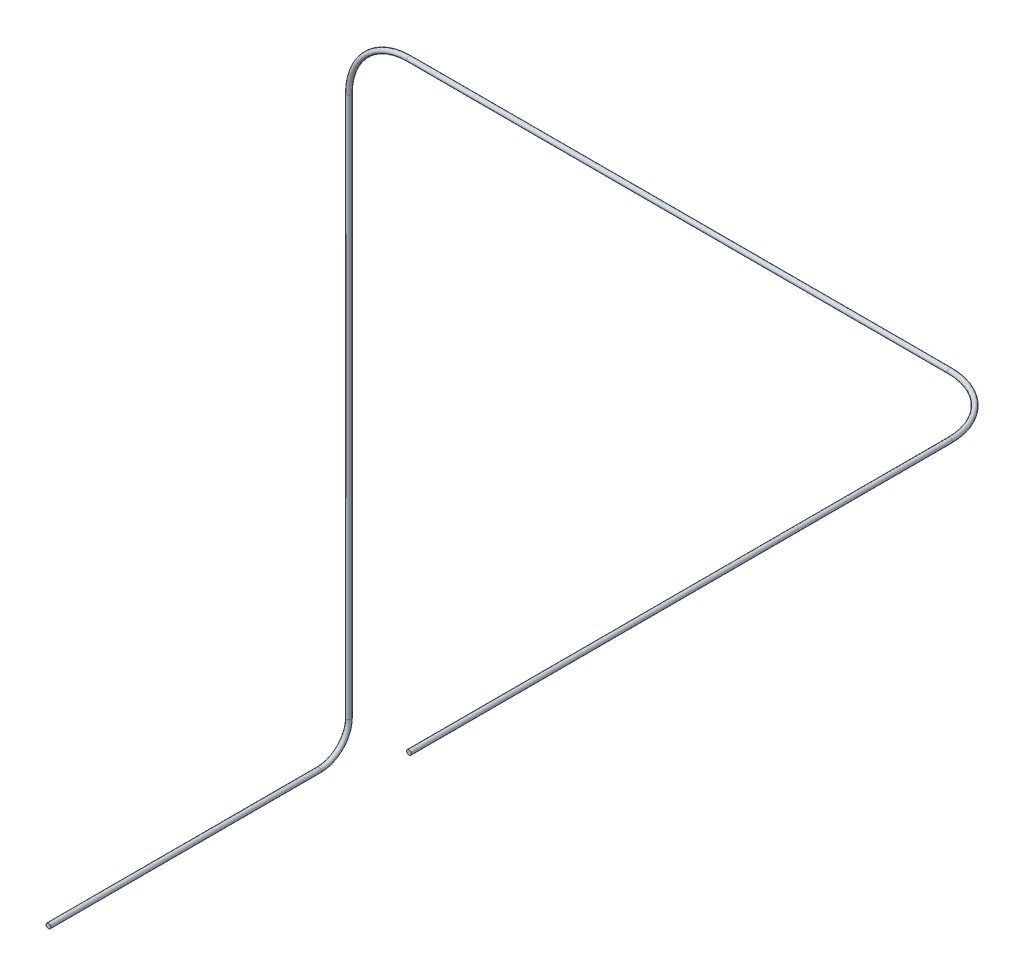
ISO-10303-21;
HEADER;
FILE_DESCRIPTION(('STEP AP214'),'2;1');
FILE_NAME('part.step','',(''),(''),'','','');
FILE_SCHEMA(('AUTOMOTIVE_DESIGN { 1 0 10303 214 1 1 1 1 }'));
ENDSEC;
DATA;
#1=APPLICATION_CONTEXT('core data for automotive mechanical design processes');
#2=APPLICATION_PROTOCOL_DEFINITION('international standard','automotive_design',2000,#1);
#3=PRODUCT_CONTEXT('',#1,'mechanical');
#4=PRODUCT('Part','Part','',(#3));
#5=PRODUCT_RELATED_PRODUCT_CATEGORY('part','',(#4));
#6=PRODUCT_DEFINITION_FORMATION('','',#4);
#7=PRODUCT_DEFINITION_CONTEXT('part definition',#1,'design');
#8=PRODUCT_DEFINITION('design','',#6,#7);
#9=PRODUCT_DEFINITION_SHAPE('','',#8);
#10=(LENGTH_UNIT() NAMED_UNIT(*) SI_UNIT(.MILLI.,.METRE.));
#11=(NAMED_UNIT(*) PLANE_ANGLE_UNIT() SI_UNIT($,.RADIAN.));
#12=(NAMED_UNIT(*) SI_UNIT($,.STERADIAN.) SOLID_ANGLE_UNIT());
#13=UNCERTAINTY_MEASURE_WITH_UNIT(LENGTH_MEASURE(1.E-05),#10,'distance_accuracy_value','');
#14=(GEOMETRIC_REPRESENTATION_CONTEXT(3) GLOBAL_UNCERTAINTY_ASSIGNED_CONTEXT((#13)) GLOBAL_UNIT_ASSIGNED_CONTEXT((#10,
#11,#12)) REPRESENTATION_CONTEXT('',''));
#15=CARTESIAN_POINT('',(0.,0.,0.));
#16=DIRECTION('',(0.,0.,1.));
#17=DIRECTION('',(1.,0.,0.));
#18=AXIS2_PLACEMENT_3D('',#15,#16,#17);
#19=CARTESIAN_POINT('',(0.,0.,0.));
#20=DIRECTION('',(0.,0.,1.));
#21=DIRECTION('',(1.,0.,0.));
#22=AXIS2_PLACEMENT_3D('',#19,#20,#21);
#23=PLANE('',#22);
#24=CARTESIAN_POINT('',(0.,0.,0.));
#25=DIRECTION('',(0.,0.,1.));
#26=DIRECTION('',(1.,0.,0.));
#27=AXIS2_PLACEMENT_3D('',#24,#25,#26);
#28=CIRCLE('',#27,2.);
#29=CARTESIAN_POINT('',(2.,0.,0.));
#30=VERTEX_POINT('',#29);
#31=EDGE_CURVE('E65',#30,#30,#28,.T.);
#32=ORIENTED_EDGE('',*,*,#31,.T.);
#33=EDGE_LOOP('',(#32));
#34=FACE_BOUND('',#33,.T.);
#35=ADVANCED_FACE('F37',(#34),#23,.T.);
#36=CARTESIAN_POINT('',(-550.,-525.,-250.));
#37=DIRECTION('',(0.,0.,-1.));
#38=DIRECTION('',(0.,-1.,0.));
#39=AXIS2_PLACEMENT_3D('',#36,#37,#38);
#40=PLANE('',#39);
#41=CARTESIAN_POINT('',(-550.,-525.,-250.));
#42=DIRECTION('',(0.,0.,-1.));
#43=DIRECTION('',(0.,-1.,0.));
#44=AXIS2_PLACEMENT_3D('',#41,#42,#43);
#45=CIRCLE('',#44,2.);
#46=CARTESIAN_POINT('',(-550.,-527.,-250.));
#47=VERTEX_POINT('',#46);
#48=EDGE_CURVE('E10',#47,#47,#45,.T.);
#49=ORIENTED_EDGE('',*,*,#48,.F.);
#50=EDGE_LOOP('',(#49));
#51=FACE_BOUND('',#50,.T.);
#52=ADVANCED_FACE('F73',(#51),#40,.F.);
#53=CARTESIAN_POINT('',(0.,0.,0.));
#54=DIRECTION('',(0.,0.,-1.));
#55=DIRECTION('',(-1.,0.,0.));
#56=AXIS2_PLACEMENT_3D('',#53,#54,#55);
#57=CYLINDRICAL_SURFACE('',#56,2.);
#58=CARTESIAN_POINT('',(0.,0.,-450.));
#59=DIRECTION('',(0.,0.,1.));
#60=DIRECTION('',(1.,0.,0.));
#61=AXIS2_PLACEMENT_3D('',#58,#59,#60);
#62=CIRCLE('',#61,2.);
#63=CARTESIAN_POINT('',(1.99999999999999,0.,-450.));
#64=VERTEX_POINT('',#63);
#65=EDGE_CURVE('E62',#64,#64,#62,.T.);
#66=ORIENTED_EDGE('',*,*,#65,.T.);
#67=EDGE_LOOP('',(#66));
#68=FACE_BOUND('',#67,.T.);
#69=ORIENTED_EDGE('',*,*,#31,.F.);
#70=EDGE_LOOP('',(#69));
#71=FACE_BOUND('',#70,.T.);
#72=ADVANCED_FACE('F70',(#68,#71),#57,.T.);
#73=CARTESIAN_POINT('',(-50.,0.,-450.));
#74=DIRECTION('',(0.,1.,0.));
#75=DIRECTION('',(0.,0.,1.));
#76=AXIS2_PLACEMENT_3D('',#73,#74,#75);
#77=TOROIDAL_SURFACE('',#76,50.,2.);
#78=CARTESIAN_POINT('',(-50.,0.,-500.));
#79=DIRECTION('',(1.,0.,0.));
#80=DIRECTION('',(0.,0.,-1.));
#81=AXIS2_PLACEMENT_3D('',#78,#79,#80);
#82=CIRCLE('',#81,2.);
#83=CARTESIAN_POINT('',(-50.,0.,-502.));
#84=VERTEX_POINT('',#83);
#85=EDGE_CURVE('E59',#84,#84,#82,.T.);
#86=CARTESIAN_POINT('',(-50.,0.,-450.));
#87=DIRECTION('',(0.,1.,0.));
#88=DIRECTION('',(0.,0.,1.));
#89=AXIS2_PLACEMENT_3D('',#86,#87,#88);
#90=CIRCLE('',#89,52.);
#91=EDGE_CURVE('',#64,#84,#90,.T.);
#92=ORIENTED_EDGE('',*,*,#65,.F.);
#93=ORIENTED_EDGE('',*,*,#85,.T.);
#94=ORIENTED_EDGE('',*,*,#91,.T.);
#95=ORIENTED_EDGE('',*,*,#91,.F.);
#96=EDGE_LOOP('',(#92,#94,#93,#95));
#97=FACE_BOUND('',#96,.T.);
#98=ADVANCED_FACE('F72',(#97),#77,.T.);
#99=CARTESIAN_POINT('',(-50.,0.,-500.));
#100=DIRECTION('',(-1.,0.,0.));
#101=DIRECTION('',(0.,0.,1.));
#102=AXIS2_PLACEMENT_3D('',#99,#100,#101);
#103=CYLINDRICAL_SURFACE('',#102,2.);
#104=CARTESIAN_POINT('',(-500.,0.,-500.));
#105=DIRECTION('',(1.,0.,0.));
#106=DIRECTION('',(0.,0.,-1.));
#107=AXIS2_PLACEMENT_3D('',#104,#105,#106);
#108=CIRCLE('',#107,2.);
#109=CARTESIAN_POINT('',(-500.,1.99999999999999,-500.));
#110=VERTEX_POINT('',#109);
#111=EDGE_CURVE('E56',#110,#110,#108,.T.);
#112=ORIENTED_EDGE('',*,*,#111,.T.);
#113=EDGE_LOOP('',(#112));
#114=FACE_BOUND('',#113,.T.);
#115=ORIENTED_EDGE('',*,*,#85,.F.);
#116=EDGE_LOOP('',(#115));
#117=FACE_BOUND('',#116,.T.);
#118=ADVANCED_FACE('F80',(#114,#117),#103,.T.);
#119=CARTESIAN_POINT('',(-500.,-50.,-500.));
#120=DIRECTION('',(0.,0.,1.));
#121=DIRECTION('',(1.,0.,0.));
#122=AXIS2_PLACEMENT_3D('',#119,#120,#121);
#123=TOROIDAL_SURFACE('',#122,50.,2.);
#124=CARTESIAN_POINT('',(-550.,-50.,-500.));
#125=DIRECTION('',(0.,1.,0.));
#126=DIRECTION('',(0.,0.,-1.));
#127=AXIS2_PLACEMENT_3D('',#124,#125,#126);
#128=CIRCLE('',#127,2.);
#129=CARTESIAN_POINT('',(-552.,-50.,-500.));
#130=VERTEX_POINT('',#129);
#131=EDGE_CURVE('E51',#130,#130,#128,.T.);
#132=CARTESIAN_POINT('',(-500.,-50.,-500.));
#133=DIRECTION('',(0.,0.,1.));
#134=DIRECTION('',(1.,0.,0.));
#135=AXIS2_PLACEMENT_3D('',#132,#133,#134);
#136=CIRCLE('',#135,52.);
#137=EDGE_CURVE('',#110,#130,#136,.T.);
#138=ORIENTED_EDGE('',*,*,#111,.F.);
#139=ORIENTED_EDGE('',*,*,#131,.T.);
#140=ORIENTED_EDGE('',*,*,#137,.T.);
#141=ORIENTED_EDGE('',*,*,#137,.F.);
#142=EDGE_LOOP('',(#138,#140,#139,#141));
#143=FACE_BOUND('',#142,.T.);
#144=ADVANCED_FACE('F97',(#143),#123,.T.);
#145=CARTESIAN_POINT('',(-550.,-50.,-500.));
#146=DIRECTION('',(0.,-1.,0.));
#147=DIRECTION('',(0.,0.,-1.));
#148=AXIS2_PLACEMENT_3D('',#145,#146,#147);
#149=CYLINDRICAL_SURFACE('',#148,2.);
#150=CARTESIAN_POINT('',(-550.,-500.,-500.));
#151=DIRECTION('',(0.,1.,0.));
#152=DIRECTION('',(0.,0.,-1.));
#153=AXIS2_PLACEMENT_3D('',#150,#151,#152);
#154=CIRCLE('',#153,2.);
#155=CARTESIAN_POINT('',(-550.,-500.,-502.));
#156=VERTEX_POINT('',#155);
#157=EDGE_CURVE('E47',#156,#156,#154,.T.);
#158=ORIENTED_EDGE('',*,*,#157,.T.);
#159=EDGE_LOOP('',(#158));
#160=FACE_BOUND('',#159,.T.);
#161=ORIENTED_EDGE('',*,*,#131,.F.);
#162=EDGE_LOOP('',(#161));
#163=FACE_BOUND('',#162,.T.);
#164=ADVANCED_FACE('F91',(#160,#163),#149,.T.);
#165=CARTESIAN_POINT('',(-550.,-500.,-475.));
#166=DIRECTION('',(-1.,0.,0.));
#167=DIRECTION('',(0.,0.,1.));
#168=AXIS2_PLACEMENT_3D('',#165,#166,#167);
#169=TOROIDAL_SURFACE('',#168,25.,2.);
#170=CARTESIAN_POINT('',(-550.,-525.,-475.));
#171=DIRECTION('',(0.,0.,-1.));
#172=DIRECTION('',(0.,-1.,0.));
#173=AXIS2_PLACEMENT_3D('',#170,#171,#172);
#174=CIRCLE('',#173,2.);
#175=CARTESIAN_POINT('',(-550.,-527.,-475.));
#176=VERTEX_POINT('',#175);
#177=EDGE_CURVE('E43',#176,#176,#174,.T.);
#178=CARTESIAN_POINT('',(-550.,-500.,-475.));
#179=DIRECTION('',(-1.,0.,0.));
#180=DIRECTION('',(0.,0.,1.));
#181=AXIS2_PLACEMENT_3D('',#178,#179,#180);
#182=CIRCLE('',#181,27.);
#183=EDGE_CURVE('',#156,#176,#182,.T.);
#184=ORIENTED_EDGE('',*,*,#157,.F.);
#185=ORIENTED_EDGE('',*,*,#177,.T.);
#186=ORIENTED_EDGE('',*,*,#183,.T.);
#187=ORIENTED_EDGE('',*,*,#183,.F.);
#188=EDGE_LOOP('',(#184,#186,#185,#187));
#189=FACE_BOUND('',#188,.T.);
#190=ADVANCED_FACE('F86',(#189),#169,.T.);
#191=CARTESIAN_POINT('',(-550.,-525.,-475.));
#192=DIRECTION('',(0.,0.,1.));
#193=DIRECTION('',(1.,0.,0.));
#194=AXIS2_PLACEMENT_3D('',#191,#192,#193);
#195=CYLINDRICAL_SURFACE('',#194,2.);
#196=ORIENTED_EDGE('',*,*,#48,.T.);
#197=EDGE_LOOP('',(#196));
#198=FACE_BOUND('',#197,.T.);
#199=ORIENTED_EDGE('',*,*,#177,.F.);
#200=EDGE_LOOP('',(#199));
#201=FACE_BOUND('',#200,.T.);
#202=ADVANCED_FACE('F84',(#198,#201),#195,.T.);
#203=CLOSED_SHELL('',(#35,#52,#72,#98,#118,#144,#164,#190,#202));
#204=MANIFOLD_SOLID_BREP('B2',#203);
#205=ADVANCED_BREP_SHAPE_REPRESENTATION('',(#18,#204),#14);
#206=SHAPE_DEFINITION_REPRESENTATION(#9,#205);
ENDSEC;
END-ISO-10303-21;
